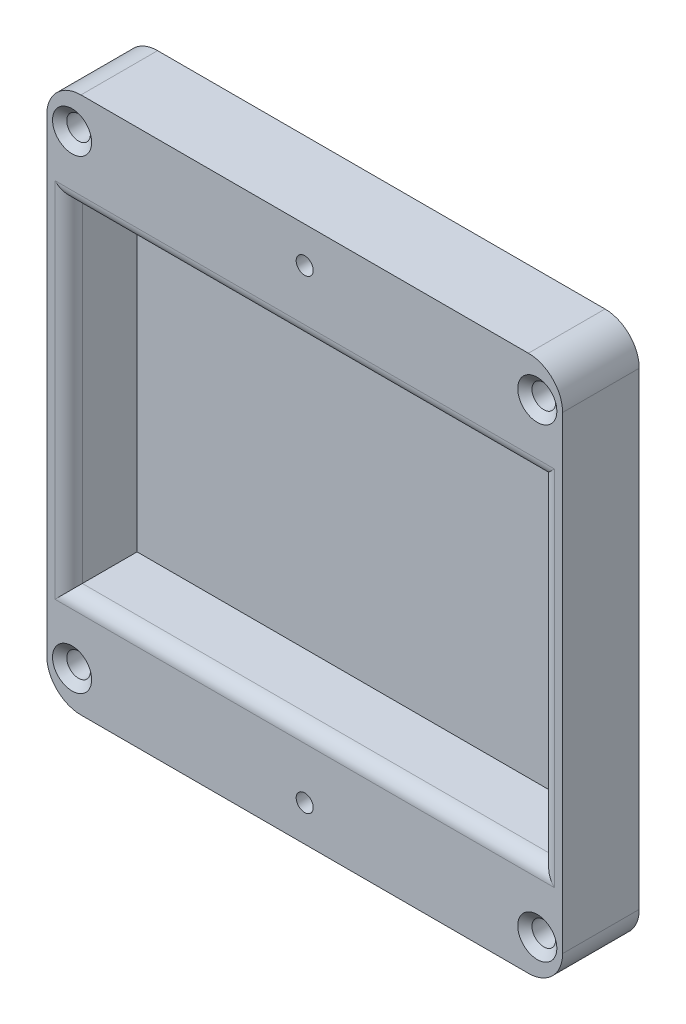
ISO-10303-21;
HEADER;
FILE_DESCRIPTION(('STEP AP214'),'2;1');
FILE_NAME('part.step','',(''),(''),'','','');
FILE_SCHEMA(('AUTOMOTIVE_DESIGN { 1 0 10303 214 1 1 1 1 }'));
ENDSEC;
DATA;
#1=APPLICATION_CONTEXT('core data for automotive mechanical design processes');
#2=APPLICATION_PROTOCOL_DEFINITION('international standard','automotive_design',2000,#1);
#3=PRODUCT_CONTEXT('',#1,'mechanical');
#4=PRODUCT('Part','Part','',(#3));
#5=PRODUCT_RELATED_PRODUCT_CATEGORY('part','',(#4));
#6=PRODUCT_DEFINITION_FORMATION('','',#4);
#7=PRODUCT_DEFINITION_CONTEXT('part definition',#1,'design');
#8=PRODUCT_DEFINITION('design','',#6,#7);
#9=PRODUCT_DEFINITION_SHAPE('','',#8);
#10=(LENGTH_UNIT() NAMED_UNIT(*) SI_UNIT(.MILLI.,.METRE.));
#11=(NAMED_UNIT(*) PLANE_ANGLE_UNIT() SI_UNIT($,.RADIAN.));
#12=(NAMED_UNIT(*) SI_UNIT($,.STERADIAN.) SOLID_ANGLE_UNIT());
#13=UNCERTAINTY_MEASURE_WITH_UNIT(LENGTH_MEASURE(1.E-05),#10,'distance_accuracy_value','');
#14=(GEOMETRIC_REPRESENTATION_CONTEXT(3) GLOBAL_UNCERTAINTY_ASSIGNED_CONTEXT((#13)) GLOBAL_UNIT_ASSIGNED_CONTEXT((#10,
#11,#12)) REPRESENTATION_CONTEXT('',''));
#15=CARTESIAN_POINT('',(0.,0.,0.));
#16=DIRECTION('',(0.,0.,1.));
#17=DIRECTION('',(1.,0.,0.));
#18=AXIS2_PLACEMENT_3D('',#15,#16,#17);
#19=CARTESIAN_POINT('',(37.7,-39.25,11.2));
#20=DIRECTION('',(-1.,0.,0.));
#21=DIRECTION('',(0.,0.,1.));
#22=AXIS2_PLACEMENT_3D('',#19,#20,#21);
#23=PLANE('',#22);
#24=DIRECTION('',(0.,1.,0.));
#25=VECTOR('',#24,1.);
#26=CARTESIAN_POINT('',(37.7,-39.25,11.2));
#27=LINE('',#26,#25);
#28=CARTESIAN_POINT('',(37.7,-34.25,11.2));
#29=VERTEX_POINT('',#28);
#30=CARTESIAN_POINT('',(37.7,34.25,11.2));
#31=VERTEX_POINT('',#30);
#32=EDGE_CURVE('E195',#29,#31,#27,.T.);
#33=ORIENTED_EDGE('',*,*,#32,.F.);
#34=DIRECTION('',(0.,0.,-1.));
#35=VECTOR('',#34,1.);
#36=CARTESIAN_POINT('',(37.7,-34.25,11.2));
#37=LINE('',#36,#35);
#38=CARTESIAN_POINT('',(37.7,-34.25,0.));
#39=VERTEX_POINT('',#38);
#40=EDGE_CURVE('E11',#29,#39,#37,.T.);
#41=ORIENTED_EDGE('',*,*,#40,.T.);
#42=DIRECTION('',(0.,1.,0.));
#43=VECTOR('',#42,1.);
#44=CARTESIAN_POINT('',(37.7,-39.25,0.));
#45=LINE('',#44,#43);
#46=CARTESIAN_POINT('',(37.7,34.25,0.));
#47=VERTEX_POINT('',#46);
#48=EDGE_CURVE('E188',#39,#47,#45,.T.);
#49=ORIENTED_EDGE('',*,*,#48,.T.);
#50=DIRECTION('',(0.,0.,-1.));
#51=VECTOR('',#50,1.);
#52=CARTESIAN_POINT('',(37.7,34.25,11.2));
#53=LINE('',#52,#51);
#54=EDGE_CURVE('E48',#47,#31,#53,.F.);
#55=ORIENTED_EDGE('',*,*,#54,.T.);
#56=EDGE_LOOP('',(#33,#41,#49,#55));
#57=FACE_BOUND('',#56,.T.);
#58=ADVANCED_FACE('F39',(#57),#23,.F.);
#59=CARTESIAN_POINT('',(-37.7,39.25,11.2));
#60=DIRECTION('',(0.,-1.,0.));
#61=DIRECTION('',(0.,0.,-1.));
#62=AXIS2_PLACEMENT_3D('',#59,#60,#61);
#63=PLANE('',#62);
#64=DIRECTION('',(-1.,0.,0.));
#65=VECTOR('',#64,1.);
#66=CARTESIAN_POINT('',(-37.7,39.25,0.));
#67=LINE('',#66,#65);
#68=CARTESIAN_POINT('',(32.7,39.25,0.));
#69=VERTEX_POINT('',#68);
#70=CARTESIAN_POINT('',(-32.7,39.25,0.));
#71=VERTEX_POINT('',#70);
#72=EDGE_CURVE('E214',#69,#71,#67,.T.);
#73=ORIENTED_EDGE('',*,*,#72,.T.);
#74=DIRECTION('',(0.,0.,-1.));
#75=VECTOR('',#74,1.);
#76=CARTESIAN_POINT('',(-32.7,39.25,11.2));
#77=LINE('',#76,#75);
#78=CARTESIAN_POINT('',(-32.7,39.25,11.2));
#79=VERTEX_POINT('',#78);
#80=EDGE_CURVE('E281',#71,#79,#77,.F.);
#81=ORIENTED_EDGE('',*,*,#80,.T.);
#82=DIRECTION('',(-1.,0.,0.));
#83=VECTOR('',#82,1.);
#84=CARTESIAN_POINT('',(-37.7,39.25,11.2));
#85=LINE('',#84,#83);
#86=CARTESIAN_POINT('',(32.7,39.25,11.2));
#87=VERTEX_POINT('',#86);
#88=EDGE_CURVE('E199',#87,#79,#85,.T.);
#89=ORIENTED_EDGE('',*,*,#88,.F.);
#90=DIRECTION('',(0.,0.,-1.));
#91=VECTOR('',#90,1.);
#92=CARTESIAN_POINT('',(32.7,39.25,11.2));
#93=LINE('',#92,#91);
#94=EDGE_CURVE('E277',#87,#69,#93,.T.);
#95=ORIENTED_EDGE('',*,*,#94,.T.);
#96=EDGE_LOOP('',(#73,#81,#89,#95));
#97=FACE_BOUND('',#96,.T.);
#98=ADVANCED_FACE('F314',(#97),#63,.F.);
#99=CARTESIAN_POINT('',(-37.7,-39.25,11.2));
#100=DIRECTION('',(1.,0.,0.));
#101=DIRECTION('',(0.,0.,-1.));
#102=AXIS2_PLACEMENT_3D('',#99,#100,#101);
#103=PLANE('',#102);
#104=DIRECTION('',(0.,-1.,0.));
#105=VECTOR('',#104,1.);
#106=CARTESIAN_POINT('',(-37.7,-39.25,11.2));
#107=LINE('',#106,#105);
#108=CARTESIAN_POINT('',(-37.7,34.25,11.2));
#109=VERTEX_POINT('',#108);
#110=CARTESIAN_POINT('',(-37.7,-34.25,11.2));
#111=VERTEX_POINT('',#110);
#112=EDGE_CURVE('E204',#109,#111,#107,.T.);
#113=ORIENTED_EDGE('',*,*,#112,.F.);
#114=DIRECTION('',(0.,0.,-1.));
#115=VECTOR('',#114,1.);
#116=CARTESIAN_POINT('',(-37.7,34.25,11.2));
#117=LINE('',#116,#115);
#118=CARTESIAN_POINT('',(-37.7,34.25,0.));
#119=VERTEX_POINT('',#118);
#120=EDGE_CURVE('E261',#109,#119,#117,.T.);
#121=ORIENTED_EDGE('',*,*,#120,.T.);
#122=DIRECTION('',(0.,-1.,0.));
#123=VECTOR('',#122,1.);
#124=CARTESIAN_POINT('',(-37.7,-39.25,0.));
#125=LINE('',#124,#123);
#126=CARTESIAN_POINT('',(-37.7,-34.25,0.));
#127=VERTEX_POINT('',#126);
#128=EDGE_CURVE('E218',#119,#127,#125,.T.);
#129=ORIENTED_EDGE('',*,*,#128,.T.);
#130=DIRECTION('',(0.,0.,-1.));
#131=VECTOR('',#130,1.);
#132=CARTESIAN_POINT('',(-37.7,-34.25,11.2));
#133=LINE('',#132,#131);
#134=EDGE_CURVE('E248',#127,#111,#133,.F.);
#135=ORIENTED_EDGE('',*,*,#134,.T.);
#136=EDGE_LOOP('',(#113,#121,#129,#135));
#137=FACE_BOUND('',#136,.T.);
#138=ADVANCED_FACE('F325',(#137),#103,.F.);
#139=CARTESIAN_POINT('',(-37.7,-39.25,11.2));
#140=DIRECTION('',(0.,1.,0.));
#141=DIRECTION('',(0.,0.,1.));
#142=AXIS2_PLACEMENT_3D('',#139,#140,#141);
#143=PLANE('',#142);
#144=DIRECTION('',(1.,0.,0.));
#145=VECTOR('',#144,1.);
#146=CARTESIAN_POINT('',(-37.7,-39.25,11.2));
#147=LINE('',#146,#145);
#148=CARTESIAN_POINT('',(-32.7,-39.25,11.2));
#149=VERTEX_POINT('',#148);
#150=CARTESIAN_POINT('',(32.7,-39.25,11.2));
#151=VERTEX_POINT('',#150);
#152=EDGE_CURVE('E207',#149,#151,#147,.T.);
#153=ORIENTED_EDGE('',*,*,#152,.F.);
#154=DIRECTION('',(0.,0.,-1.));
#155=VECTOR('',#154,1.);
#156=CARTESIAN_POINT('',(-32.7,-39.25,11.2));
#157=LINE('',#156,#155);
#158=CARTESIAN_POINT('',(-32.7,-39.25,0.));
#159=VERTEX_POINT('',#158);
#160=EDGE_CURVE('E297',#149,#159,#157,.T.);
#161=ORIENTED_EDGE('',*,*,#160,.T.);
#162=DIRECTION('',(1.,0.,0.));
#163=VECTOR('',#162,1.);
#164=CARTESIAN_POINT('',(-37.7,-39.25,0.));
#165=LINE('',#164,#163);
#166=CARTESIAN_POINT('',(32.7,-39.25,0.));
#167=VERTEX_POINT('',#166);
#168=EDGE_CURVE('E200',#159,#167,#165,.T.);
#169=ORIENTED_EDGE('',*,*,#168,.T.);
#170=DIRECTION('',(0.,0.,-1.));
#171=VECTOR('',#170,1.);
#172=CARTESIAN_POINT('',(32.7,-39.25,11.2));
#173=LINE('',#172,#171);
#174=EDGE_CURVE('E55',#167,#151,#173,.F.);
#175=ORIENTED_EDGE('',*,*,#174,.T.);
#176=EDGE_LOOP('',(#153,#161,#169,#175));
#177=FACE_BOUND('',#176,.T.);
#178=ADVANCED_FACE('F331',(#177),#143,.F.);
#179=CARTESIAN_POINT('',(0.,0.,11.2));
#180=DIRECTION('',(0.,0.,-1.));
#181=DIRECTION('',(-1.,0.,0.));
#182=AXIS2_PLACEMENT_3D('',#179,#180,#181);
#183=PLANE('',#182);
#184=CARTESIAN_POINT('',(34.,-34.,11.2));
#185=DIRECTION('',(0.,0.,1.));
#186=DIRECTION('',(1.,0.,0.));
#187=AXIS2_PLACEMENT_3D('',#184,#185,#186);
#188=CIRCLE('',#187,2.8575);
#189=CARTESIAN_POINT('',(36.8575,-34.,11.2));
#190=VERTEX_POINT('',#189);
#191=EDGE_CURVE('E624',#190,#190,#188,.T.);
#192=ORIENTED_EDGE('',*,*,#191,.F.);
#193=EDGE_LOOP('',(#192));
#194=FACE_BOUND('',#193,.T.);
#195=CARTESIAN_POINT('',(-34.,-34.,11.2));
#196=DIRECTION('',(0.,0.,1.));
#197=DIRECTION('',(1.,0.,0.));
#198=AXIS2_PLACEMENT_3D('',#195,#196,#197);
#199=CIRCLE('',#198,2.8575);
#200=CARTESIAN_POINT('',(-31.1425,-34.,11.2));
#201=VERTEX_POINT('',#200);
#202=EDGE_CURVE('E634',#201,#201,#199,.T.);
#203=ORIENTED_EDGE('',*,*,#202,.F.);
#204=EDGE_LOOP('',(#203));
#205=FACE_BOUND('',#204,.T.);
#206=CARTESIAN_POINT('',(-34.,34.,11.2));
#207=DIRECTION('',(0.,0.,1.));
#208=DIRECTION('',(1.,0.,0.));
#209=AXIS2_PLACEMENT_3D('',#206,#207,#208);
#210=CIRCLE('',#209,2.8575);
#211=CARTESIAN_POINT('',(-31.1425,34.,11.2));
#212=VERTEX_POINT('',#211);
#213=EDGE_CURVE('E646',#212,#212,#210,.T.);
#214=ORIENTED_EDGE('',*,*,#213,.F.);
#215=EDGE_LOOP('',(#214));
#216=FACE_BOUND('',#215,.T.);
#217=CARTESIAN_POINT('',(34.,34.,11.2));
#218=DIRECTION('',(0.,0.,1.));
#219=DIRECTION('',(1.,0.,0.));
#220=AXIS2_PLACEMENT_3D('',#217,#218,#219);
#221=CIRCLE('',#220,2.8575);
#222=CARTESIAN_POINT('',(36.8575,34.,11.2));
#223=VERTEX_POINT('',#222);
#224=EDGE_CURVE('E658',#223,#223,#221,.T.);
#225=ORIENTED_EDGE('',*,*,#224,.F.);
#226=EDGE_LOOP('',(#225));
#227=FACE_BOUND('',#226,.T.);
#228=CARTESIAN_POINT('',(0.,34.,11.2));
#229=DIRECTION('',(0.,0.,1.));
#230=DIRECTION('',(1.,0.,0.));
#231=AXIS2_PLACEMENT_3D('',#228,#229,#230);
#232=CIRCLE('',#231,1.2446);
#233=CARTESIAN_POINT('',(1.2446,34.,11.2));
#234=VERTEX_POINT('',#233);
#235=EDGE_CURVE('E672',#234,#234,#232,.T.);
#236=ORIENTED_EDGE('',*,*,#235,.F.);
#237=EDGE_LOOP('',(#236));
#238=FACE_BOUND('',#237,.T.);
#239=CARTESIAN_POINT('',(0.,-34.,11.2));
#240=DIRECTION('',(0.,0.,1.));
#241=DIRECTION('',(-1.,0.,0.));
#242=AXIS2_PLACEMENT_3D('',#239,#240,#241);
#243=CIRCLE('',#242,1.2446);
#244=CARTESIAN_POINT('',(-1.2446,-34.,11.2));
#245=VERTEX_POINT('',#244);
#246=EDGE_CURVE('E178',#245,#245,#243,.T.);
#247=ORIENTED_EDGE('',*,*,#246,.F.);
#248=EDGE_LOOP('',(#247));
#249=FACE_BOUND('',#248,.T.);
#250=DIRECTION('',(1.,0.,0.));
#251=VECTOR('',#250,1.);
#252=CARTESIAN_POINT('',(0.,-26.5,11.2));
#253=LINE('',#252,#251);
#254=CARTESIAN_POINT('',(36.5,-26.5,11.2));
#255=VERTEX_POINT('',#254);
#256=CARTESIAN_POINT('',(-36.5,-26.5,11.2));
#257=VERTEX_POINT('',#256);
#258=EDGE_CURVE('E233',#255,#257,#253,.F.);
#259=ORIENTED_EDGE('',*,*,#258,.T.);
#260=DIRECTION('',(0.,-1.,0.));
#261=VECTOR('',#260,1.);
#262=CARTESIAN_POINT('',(-36.5,0.,11.2));
#263=LINE('',#262,#261);
#264=CARTESIAN_POINT('',(-36.5,26.5,11.2));
#265=VERTEX_POINT('',#264);
#266=EDGE_CURVE('E236',#257,#265,#263,.F.);
#267=ORIENTED_EDGE('',*,*,#266,.T.);
#268=DIRECTION('',(-1.,0.,0.));
#269=VECTOR('',#268,1.);
#270=CARTESIAN_POINT('',(0.,26.5,11.2));
#271=LINE('',#270,#269);
#272=CARTESIAN_POINT('',(36.5,26.5,11.2));
#273=VERTEX_POINT('',#272);
#274=EDGE_CURVE('E227',#265,#273,#271,.F.);
#275=ORIENTED_EDGE('',*,*,#274,.T.);
#276=DIRECTION('',(0.,1.,0.));
#277=VECTOR('',#276,1.);
#278=CARTESIAN_POINT('',(36.5,0.,11.2));
#279=LINE('',#278,#277);
#280=EDGE_CURVE('E230',#273,#255,#279,.F.);
#281=ORIENTED_EDGE('',*,*,#280,.T.);
#282=EDGE_LOOP('',(#259,#267,#275,#281));
#283=FACE_BOUND('',#282,.T.);
#284=ORIENTED_EDGE('',*,*,#88,.T.);
#285=CARTESIAN_POINT('',(-32.7,34.25,11.2));
#286=DIRECTION('',(0.,0.,-1.));
#287=DIRECTION('',(-1.,0.,0.));
#288=AXIS2_PLACEMENT_3D('',#285,#286,#287);
#289=CIRCLE('',#288,5.);
#290=EDGE_CURVE('E292',#79,#109,#289,.F.);
#291=ORIENTED_EDGE('',*,*,#290,.T.);
#292=ORIENTED_EDGE('',*,*,#112,.T.);
#293=CARTESIAN_POINT('',(-32.7,-34.25,11.2));
#294=DIRECTION('',(0.,0.,-1.));
#295=DIRECTION('',(-1.,0.,0.));
#296=AXIS2_PLACEMENT_3D('',#293,#294,#295);
#297=CIRCLE('',#296,5.);
#298=EDGE_CURVE('E62',#111,#149,#297,.F.);
#299=ORIENTED_EDGE('',*,*,#298,.T.);
#300=ORIENTED_EDGE('',*,*,#152,.T.);
#301=CARTESIAN_POINT('',(32.7,-34.25,11.2));
#302=DIRECTION('',(0.,0.,-1.));
#303=DIRECTION('',(-1.,0.,0.));
#304=AXIS2_PLACEMENT_3D('',#301,#302,#303);
#305=CIRCLE('',#304,5.);
#306=EDGE_CURVE('E287',#151,#29,#305,.F.);
#307=ORIENTED_EDGE('',*,*,#306,.T.);
#308=ORIENTED_EDGE('',*,*,#32,.T.);
#309=CARTESIAN_POINT('',(32.7,34.25,11.2));
#310=DIRECTION('',(0.,0.,-1.));
#311=DIRECTION('',(-1.,0.,0.));
#312=AXIS2_PLACEMENT_3D('',#309,#310,#311);
#313=CIRCLE('',#312,5.);
#314=EDGE_CURVE('E284',#31,#87,#313,.F.);
#315=ORIENTED_EDGE('',*,*,#314,.T.);
#316=EDGE_LOOP('',(#284,#291,#292,#299,#300,#307,#308,#315));
#317=FACE_BOUND('',#316,.T.);
#318=ADVANCED_FACE('F308',(#194,#205,#216,#227,#238,#249,#283,#317),#183,.F.);
#319=CARTESIAN_POINT('',(0.,0.,0.));
#320=DIRECTION('',(0.,0.,-1.));
#321=DIRECTION('',(-1.,0.,0.));
#322=AXIS2_PLACEMENT_3D('',#319,#320,#321);
#323=PLANE('',#322);
#324=CARTESIAN_POINT('',(34.,-34.,0.));
#325=DIRECTION('',(0.,0.,1.));
#326=DIRECTION('',(1.,0.,0.));
#327=AXIS2_PLACEMENT_3D('',#324,#325,#326);
#328=CIRCLE('',#327,1.7272);
#329=CARTESIAN_POINT('',(35.7272,-34.,0.));
#330=VERTEX_POINT('',#329);
#331=EDGE_CURVE('E628',#330,#330,#328,.T.);
#332=ORIENTED_EDGE('',*,*,#331,.T.);
#333=EDGE_LOOP('',(#332));
#334=FACE_BOUND('',#333,.T.);
#335=CARTESIAN_POINT('',(-34.,-34.,0.));
#336=DIRECTION('',(0.,0.,1.));
#337=DIRECTION('',(1.,0.,0.));
#338=AXIS2_PLACEMENT_3D('',#335,#336,#337);
#339=CIRCLE('',#338,1.7272);
#340=CARTESIAN_POINT('',(-32.2728,-34.,0.));
#341=VERTEX_POINT('',#340);
#342=EDGE_CURVE('E642',#341,#341,#339,.T.);
#343=ORIENTED_EDGE('',*,*,#342,.T.);
#344=EDGE_LOOP('',(#343));
#345=FACE_BOUND('',#344,.T.);
#346=CARTESIAN_POINT('',(-34.,34.,0.));
#347=DIRECTION('',(0.,0.,1.));
#348=DIRECTION('',(1.,0.,0.));
#349=AXIS2_PLACEMENT_3D('',#346,#347,#348);
#350=CIRCLE('',#349,1.7272);
#351=CARTESIAN_POINT('',(-32.2728,34.,0.));
#352=VERTEX_POINT('',#351);
#353=EDGE_CURVE('E654',#352,#352,#350,.T.);
#354=ORIENTED_EDGE('',*,*,#353,.T.);
#355=EDGE_LOOP('',(#354));
#356=FACE_BOUND('',#355,.T.);
#357=CARTESIAN_POINT('',(34.,34.,0.));
#358=DIRECTION('',(0.,0.,1.));
#359=DIRECTION('',(1.,0.,0.));
#360=AXIS2_PLACEMENT_3D('',#357,#358,#359);
#361=CIRCLE('',#360,1.7272);
#362=CARTESIAN_POINT('',(35.7272,34.,0.));
#363=VERTEX_POINT('',#362);
#364=EDGE_CURVE('E666',#363,#363,#361,.T.);
#365=ORIENTED_EDGE('',*,*,#364,.T.);
#366=EDGE_LOOP('',(#365));
#367=FACE_BOUND('',#366,.T.);
#368=ORIENTED_EDGE('',*,*,#128,.F.);
#369=CARTESIAN_POINT('',(-32.7,34.25,0.));
#370=DIRECTION('',(0.,0.,-1.));
#371=DIRECTION('',(-1.,0.,0.));
#372=AXIS2_PLACEMENT_3D('',#369,#370,#371);
#373=CIRCLE('',#372,5.);
#374=EDGE_CURVE('E274',#119,#71,#373,.T.);
#375=ORIENTED_EDGE('',*,*,#374,.T.);
#376=ORIENTED_EDGE('',*,*,#72,.F.);
#377=CARTESIAN_POINT('',(32.7,34.25,0.));
#378=DIRECTION('',(0.,0.,-1.));
#379=DIRECTION('',(-1.,0.,0.));
#380=AXIS2_PLACEMENT_3D('',#377,#378,#379);
#381=CIRCLE('',#380,5.);
#382=EDGE_CURVE('E265',#69,#47,#381,.T.);
#383=ORIENTED_EDGE('',*,*,#382,.T.);
#384=ORIENTED_EDGE('',*,*,#48,.F.);
#385=CARTESIAN_POINT('',(32.7,-34.25,0.));
#386=DIRECTION('',(0.,0.,-1.));
#387=DIRECTION('',(-1.,0.,0.));
#388=AXIS2_PLACEMENT_3D('',#385,#386,#387);
#389=CIRCLE('',#388,5.);
#390=EDGE_CURVE('E268',#39,#167,#389,.T.);
#391=ORIENTED_EDGE('',*,*,#390,.T.);
#392=ORIENTED_EDGE('',*,*,#168,.F.);
#393=CARTESIAN_POINT('',(-32.7,-34.25,0.));
#394=DIRECTION('',(0.,0.,-1.));
#395=DIRECTION('',(-1.,0.,0.));
#396=AXIS2_PLACEMENT_3D('',#393,#394,#395);
#397=CIRCLE('',#396,5.);
#398=EDGE_CURVE('E271',#159,#127,#397,.T.);
#399=ORIENTED_EDGE('',*,*,#398,.T.);
#400=EDGE_LOOP('',(#368,#375,#376,#383,#384,#391,#392,#399));
#401=FACE_BOUND('',#400,.T.);
#402=ADVANCED_FACE('F318',(#334,#345,#356,#367,#401),#323,.T.);
#403=CARTESIAN_POINT('',(34.5,24.5,1.2));
#404=DIRECTION('',(1.,0.,0.));
#405=DIRECTION('',(0.,0.,-1.));
#406=AXIS2_PLACEMENT_3D('',#403,#404,#405);
#407=PLANE('',#406);
#408=DIRECTION('',(0.,0.,1.));
#409=VECTOR('',#408,1.);
#410=CARTESIAN_POINT('',(34.5,-24.5,1.2));
#411=LINE('',#410,#409);
#412=CARTESIAN_POINT('',(34.5,-24.5,1.2));
#413=VERTEX_POINT('',#412);
#414=CARTESIAN_POINT('',(34.5,-24.5,9.2));
#415=VERTEX_POINT('',#414);
#416=EDGE_CURVE('E185',#413,#415,#411,.T.);
#417=ORIENTED_EDGE('',*,*,#416,.T.);
#418=DIRECTION('',(0.,1.,0.));
#419=VECTOR('',#418,1.);
#420=CARTESIAN_POINT('',(34.5,24.5,9.2));
#421=LINE('',#420,#419);
#422=CARTESIAN_POINT('',(34.5,24.5,9.2));
#423=VERTEX_POINT('',#422);
#424=EDGE_CURVE('E151',#415,#423,#421,.T.);
#425=ORIENTED_EDGE('',*,*,#424,.T.);
#426=DIRECTION('',(0.,0.,1.));
#427=VECTOR('',#426,1.);
#428=CARTESIAN_POINT('',(34.5,24.5,1.2));
#429=LINE('',#428,#427);
#430=CARTESIAN_POINT('',(34.5,24.5,1.2));
#431=VERTEX_POINT('',#430);
#432=EDGE_CURVE('E143',#431,#423,#429,.T.);
#433=ORIENTED_EDGE('',*,*,#432,.F.);
#434=DIRECTION('',(0.,1.,0.));
#435=VECTOR('',#434,1.);
#436=CARTESIAN_POINT('',(34.5,24.5,1.2));
#437=LINE('',#436,#435);
#438=EDGE_CURVE('E148',#413,#431,#437,.T.);
#439=ORIENTED_EDGE('',*,*,#438,.F.);
#440=EDGE_LOOP('',(#417,#425,#433,#439));
#441=FACE_BOUND('',#440,.T.);
#442=ADVANCED_FACE('F146',(#441),#407,.F.);
#443=CARTESIAN_POINT('',(-34.5,-24.5,1.2));
#444=DIRECTION('',(0.,-1.,0.));
#445=DIRECTION('',(0.,0.,-1.));
#446=AXIS2_PLACEMENT_3D('',#443,#444,#445);
#447=PLANE('',#446);
#448=DIRECTION('',(0.,0.,1.));
#449=VECTOR('',#448,1.);
#450=CARTESIAN_POINT('',(-34.5,-24.5,1.2));
#451=LINE('',#450,#449);
#452=CARTESIAN_POINT('',(-34.5,-24.5,1.2));
#453=VERTEX_POINT('',#452);
#454=CARTESIAN_POINT('',(-34.5,-24.5,9.2));
#455=VERTEX_POINT('',#454);
#456=EDGE_CURVE('E189',#453,#455,#451,.T.);
#457=ORIENTED_EDGE('',*,*,#456,.T.);
#458=DIRECTION('',(1.,0.,0.));
#459=VECTOR('',#458,1.);
#460=CARTESIAN_POINT('',(-34.5,-24.5,9.2));
#461=LINE('',#460,#459);
#462=EDGE_CURVE('E240',#455,#415,#461,.T.);
#463=ORIENTED_EDGE('',*,*,#462,.T.);
#464=ORIENTED_EDGE('',*,*,#416,.F.);
#465=DIRECTION('',(1.,0.,0.));
#466=VECTOR('',#465,1.);
#467=CARTESIAN_POINT('',(-34.5,-24.5,1.2));
#468=LINE('',#467,#466);
#469=EDGE_CURVE('E156',#453,#413,#468,.T.);
#470=ORIENTED_EDGE('',*,*,#469,.F.);
#471=EDGE_LOOP('',(#457,#463,#464,#470));
#472=FACE_BOUND('',#471,.T.);
#473=ADVANCED_FACE('F392',(#472),#447,.F.);
#474=CARTESIAN_POINT('',(-34.5,24.5,1.2));
#475=DIRECTION('',(-1.,0.,0.));
#476=DIRECTION('',(0.,-1.,0.));
#477=AXIS2_PLACEMENT_3D('',#474,#475,#476);
#478=PLANE('',#477);
#479=DIRECTION('',(0.,0.,1.));
#480=VECTOR('',#479,1.);
#481=CARTESIAN_POINT('',(-34.5,24.5,1.2));
#482=LINE('',#481,#480);
#483=CARTESIAN_POINT('',(-34.5,24.5,1.2));
#484=VERTEX_POINT('',#483);
#485=CARTESIAN_POINT('',(-34.5,24.5,9.2));
#486=VERTEX_POINT('',#485);
#487=EDGE_CURVE('E155',#484,#486,#482,.T.);
#488=ORIENTED_EDGE('',*,*,#487,.T.);
#489=DIRECTION('',(0.,-1.,0.));
#490=VECTOR('',#489,1.);
#491=CARTESIAN_POINT('',(-34.5,24.5,9.2));
#492=LINE('',#491,#490);
#493=EDGE_CURVE('E210',#486,#455,#492,.T.);
#494=ORIENTED_EDGE('',*,*,#493,.T.);
#495=ORIENTED_EDGE('',*,*,#456,.F.);
#496=DIRECTION('',(0.,-1.,0.));
#497=VECTOR('',#496,1.);
#498=CARTESIAN_POINT('',(-34.5,24.5,1.2));
#499=LINE('',#498,#497);
#500=EDGE_CURVE('E166',#484,#453,#499,.T.);
#501=ORIENTED_EDGE('',*,*,#500,.F.);
#502=EDGE_LOOP('',(#488,#494,#495,#501));
#503=FACE_BOUND('',#502,.T.);
#504=ADVANCED_FACE('F395',(#503),#478,.F.);
#505=CARTESIAN_POINT('',(-34.5,24.5,1.2));
#506=DIRECTION('',(0.,1.,0.));
#507=DIRECTION('',(0.,0.,1.));
#508=AXIS2_PLACEMENT_3D('',#505,#506,#507);
#509=PLANE('',#508);
#510=ORIENTED_EDGE('',*,*,#432,.T.);
#511=DIRECTION('',(-1.,0.,0.));
#512=VECTOR('',#511,1.);
#513=CARTESIAN_POINT('',(-34.5,24.5,9.2));
#514=LINE('',#513,#512);
#515=EDGE_CURVE('E245',#423,#486,#514,.T.);
#516=ORIENTED_EDGE('',*,*,#515,.T.);
#517=ORIENTED_EDGE('',*,*,#487,.F.);
#518=DIRECTION('',(-1.,0.,0.));
#519=VECTOR('',#518,1.);
#520=CARTESIAN_POINT('',(-34.5,24.5,1.2));
#521=LINE('',#520,#519);
#522=EDGE_CURVE('E159',#431,#484,#521,.T.);
#523=ORIENTED_EDGE('',*,*,#522,.F.);
#524=EDGE_LOOP('',(#510,#516,#517,#523));
#525=FACE_BOUND('',#524,.T.);
#526=ADVANCED_FACE('F160',(#525),#509,.F.);
#527=CARTESIAN_POINT('',(0.,0.,1.2));
#528=DIRECTION('',(0.,0.,1.));
#529=DIRECTION('',(1.,0.,0.));
#530=AXIS2_PLACEMENT_3D('',#527,#528,#529);
#531=PLANE('',#530);
#532=ORIENTED_EDGE('',*,*,#438,.T.);
#533=ORIENTED_EDGE('',*,*,#522,.T.);
#534=ORIENTED_EDGE('',*,*,#500,.T.);
#535=ORIENTED_EDGE('',*,*,#469,.T.);
#536=EDGE_LOOP('',(#532,#533,#534,#535));
#537=FACE_BOUND('',#536,.T.);
#538=ADVANCED_FACE('F168',(#537),#531,.T.);
#539=CARTESIAN_POINT('',(36.5,24.5,9.2));
#540=DIRECTION('',(0.,1.,0.));
#541=DIRECTION('',(0.,0.,1.));
#542=AXIS2_PLACEMENT_3D('',#539,#540,#541);
#543=CYLINDRICAL_SURFACE('',#542,2.);
#544=CARTESIAN_POINT('',(36.5,-26.5,9.2));
#545=DIRECTION('',(0.707106781186547,0.707106781186547,0.));
#546=DIRECTION('',(0.707106781186547,-0.707106781186547,0.));
#547=AXIS2_PLACEMENT_3D('',#544,#545,#546);
#548=ELLIPSE('',#547,2.82842712474619,2.);
#549=EDGE_CURVE('E175',#255,#415,#548,.F.);
#550=ORIENTED_EDGE('',*,*,#549,.F.);
#551=ORIENTED_EDGE('',*,*,#280,.F.);
#552=CARTESIAN_POINT('',(36.5,26.5,9.2));
#553=DIRECTION('',(-0.707106781186547,0.707106781186547,0.));
#554=DIRECTION('',(0.707106781186547,0.707106781186547,0.));
#555=AXIS2_PLACEMENT_3D('',#552,#553,#554);
#556=ELLIPSE('',#555,2.82842712474619,2.);
#557=EDGE_CURVE('E171',#423,#273,#556,.T.);
#558=ORIENTED_EDGE('',*,*,#557,.F.);
#559=ORIENTED_EDGE('',*,*,#424,.F.);
#560=EDGE_LOOP('',(#550,#551,#558,#559));
#561=FACE_BOUND('',#560,.T.);
#562=ADVANCED_FACE('F361',(#561),#543,.T.);
#563=CARTESIAN_POINT('',(-34.5,26.5,9.2));
#564=DIRECTION('',(-1.,0.,0.));
#565=DIRECTION('',(0.,0.,1.));
#566=AXIS2_PLACEMENT_3D('',#563,#564,#565);
#567=CYLINDRICAL_SURFACE('',#566,2.);
#568=ORIENTED_EDGE('',*,*,#557,.T.);
#569=ORIENTED_EDGE('',*,*,#274,.F.);
#570=CARTESIAN_POINT('',(-36.5,26.5,9.2));
#571=DIRECTION('',(-0.707106781186547,-0.707106781186548,0.));
#572=DIRECTION('',(0.707106781186548,-0.707106781186547,0.));
#573=AXIS2_PLACEMENT_3D('',#570,#571,#572);
#574=ELLIPSE('',#573,2.82842712474619,2.);
#575=EDGE_CURVE('E252',#486,#265,#574,.T.);
#576=ORIENTED_EDGE('',*,*,#575,.F.);
#577=ORIENTED_EDGE('',*,*,#515,.F.);
#578=EDGE_LOOP('',(#568,#569,#576,#577));
#579=FACE_BOUND('',#578,.T.);
#580=ADVANCED_FACE('F357',(#579),#567,.T.);
#581=CARTESIAN_POINT('',(-34.5,-26.5,9.2));
#582=DIRECTION('',(1.,0.,0.));
#583=DIRECTION('',(0.,0.,-1.));
#584=AXIS2_PLACEMENT_3D('',#581,#582,#583);
#585=CYLINDRICAL_SURFACE('',#584,2.);
#586=ORIENTED_EDGE('',*,*,#549,.T.);
#587=ORIENTED_EDGE('',*,*,#462,.F.);
#588=CARTESIAN_POINT('',(-36.5,-26.5,9.2));
#589=DIRECTION('',(0.707106781186548,-0.707106781186547,0.));
#590=DIRECTION('',(-0.707106781186547,-0.707106781186548,0.));
#591=AXIS2_PLACEMENT_3D('',#588,#589,#590);
#592=ELLIPSE('',#591,2.82842712474619,2.);
#593=EDGE_CURVE('E249',#257,#455,#592,.F.);
#594=ORIENTED_EDGE('',*,*,#593,.F.);
#595=ORIENTED_EDGE('',*,*,#258,.F.);
#596=EDGE_LOOP('',(#586,#587,#594,#595));
#597=FACE_BOUND('',#596,.T.);
#598=ADVANCED_FACE('F353',(#597),#585,.T.);
#599=CARTESIAN_POINT('',(-36.5,24.5,9.2));
#600=DIRECTION('',(0.,-1.,0.));
#601=DIRECTION('',(1.,0.,0.));
#602=AXIS2_PLACEMENT_3D('',#599,#600,#601);
#603=CYLINDRICAL_SURFACE('',#602,2.);
#604=ORIENTED_EDGE('',*,*,#575,.T.);
#605=ORIENTED_EDGE('',*,*,#266,.F.);
#606=ORIENTED_EDGE('',*,*,#593,.T.);
#607=ORIENTED_EDGE('',*,*,#493,.F.);
#608=EDGE_LOOP('',(#604,#605,#606,#607));
#609=FACE_BOUND('',#608,.T.);
#610=ADVANCED_FACE('F349',(#609),#603,.T.);
#611=CARTESIAN_POINT('',(0.,-34.,1.2));
#612=DIRECTION('',(0.,0.,1.));
#613=DIRECTION('',(1.,0.,0.));
#614=AXIS2_PLACEMENT_3D('',#611,#612,#613);
#615=CYLINDRICAL_SURFACE('',#614,1.2446);
#616=CARTESIAN_POINT('',(0.,-34.,1.2));
#617=DIRECTION('',(0.,0.,1.));
#618=DIRECTION('',(-1.,0.,0.));
#619=AXIS2_PLACEMENT_3D('',#616,#617,#618);
#620=CIRCLE('',#619,1.2446);
#621=CARTESIAN_POINT('',(-1.2446,-34.,1.2));
#622=VERTEX_POINT('',#621);
#623=EDGE_CURVE('E675',#622,#622,#620,.T.);
#624=ORIENTED_EDGE('',*,*,#623,.F.);
#625=EDGE_LOOP('',(#624));
#626=FACE_BOUND('',#625,.T.);
#627=ORIENTED_EDGE('',*,*,#246,.T.);
#628=EDGE_LOOP('',(#627));
#629=FACE_BOUND('',#628,.T.);
#630=ADVANCED_FACE('F352',(#626,#629),#615,.F.);
#631=CARTESIAN_POINT('',(0.,-34.,1.2));
#632=DIRECTION('',(0.,0.,-1.));
#633=DIRECTION('',(-1.,0.,0.));
#634=AXIS2_PLACEMENT_3D('',#631,#632,#633);
#635=PLANE('',#634);
#636=ORIENTED_EDGE('',*,*,#623,.T.);
#637=EDGE_LOOP('',(#636));
#638=FACE_BOUND('',#637,.T.);
#639=ADVANCED_FACE('F377',(#638),#635,.F.);
#640=CARTESIAN_POINT('',(0.,34.,1.2));
#641=DIRECTION('',(0.,0.,1.));
#642=DIRECTION('',(1.,0.,0.));
#643=AXIS2_PLACEMENT_3D('',#640,#641,#642);
#644=CYLINDRICAL_SURFACE('',#643,1.2446);
#645=CARTESIAN_POINT('',(0.,34.,1.2));
#646=DIRECTION('',(0.,0.,1.));
#647=DIRECTION('',(1.,0.,0.));
#648=AXIS2_PLACEMENT_3D('',#645,#646,#647);
#649=CIRCLE('',#648,1.2446);
#650=CARTESIAN_POINT('',(1.2446,34.,1.2));
#651=VERTEX_POINT('',#650);
#652=EDGE_CURVE('E253',#651,#651,#649,.T.);
#653=ORIENTED_EDGE('',*,*,#652,.F.);
#654=EDGE_LOOP('',(#653));
#655=FACE_BOUND('',#654,.T.);
#656=ORIENTED_EDGE('',*,*,#235,.T.);
#657=EDGE_LOOP('',(#656));
#658=FACE_BOUND('',#657,.T.);
#659=ADVANCED_FACE('F371',(#655,#658),#644,.F.);
#660=CARTESIAN_POINT('',(0.,34.,1.2));
#661=DIRECTION('',(0.,0.,1.));
#662=DIRECTION('',(1.,0.,0.));
#663=AXIS2_PLACEMENT_3D('',#660,#661,#662);
#664=PLANE('',#663);
#665=ORIENTED_EDGE('',*,*,#652,.T.);
#666=EDGE_LOOP('',(#665));
#667=FACE_BOUND('',#666,.T.);
#668=ADVANCED_FACE('F367',(#667),#664,.T.);
#669=CARTESIAN_POINT('',(-32.7,34.25,11.2));
#670=DIRECTION('',(0.,0.,-1.));
#671=DIRECTION('',(-1.,0.,0.));
#672=AXIS2_PLACEMENT_3D('',#669,#670,#671);
#673=CYLINDRICAL_SURFACE('',#672,5.);
#674=ORIENTED_EDGE('',*,*,#290,.F.);
#675=ORIENTED_EDGE('',*,*,#80,.F.);
#676=ORIENTED_EDGE('',*,*,#374,.F.);
#677=ORIENTED_EDGE('',*,*,#120,.F.);
#678=EDGE_LOOP('',(#674,#675,#676,#677));
#679=FACE_BOUND('',#678,.T.);
#680=ADVANCED_FACE('F322',(#679),#673,.T.);
#681=CARTESIAN_POINT('',(-32.7,-34.25,11.2));
#682=DIRECTION('',(0.,0.,-1.));
#683=DIRECTION('',(-1.,0.,0.));
#684=AXIS2_PLACEMENT_3D('',#681,#682,#683);
#685=CYLINDRICAL_SURFACE('',#684,5.);
#686=ORIENTED_EDGE('',*,*,#298,.F.);
#687=ORIENTED_EDGE('',*,*,#134,.F.);
#688=ORIENTED_EDGE('',*,*,#398,.F.);
#689=ORIENTED_EDGE('',*,*,#160,.F.);
#690=EDGE_LOOP('',(#686,#687,#688,#689));
#691=FACE_BOUND('',#690,.T.);
#692=ADVANCED_FACE('F329',(#691),#685,.T.);
#693=CARTESIAN_POINT('',(32.7,-34.25,11.2));
#694=DIRECTION('',(0.,0.,-1.));
#695=DIRECTION('',(-1.,0.,0.));
#696=AXIS2_PLACEMENT_3D('',#693,#694,#695);
#697=CYLINDRICAL_SURFACE('',#696,5.);
#698=ORIENTED_EDGE('',*,*,#306,.F.);
#699=ORIENTED_EDGE('',*,*,#174,.F.);
#700=ORIENTED_EDGE('',*,*,#390,.F.);
#701=ORIENTED_EDGE('',*,*,#40,.F.);
#702=EDGE_LOOP('',(#698,#699,#700,#701));
#703=FACE_BOUND('',#702,.T.);
#704=ADVANCED_FACE('F333',(#703),#697,.T.);
#705=CARTESIAN_POINT('',(32.7,34.25,11.2));
#706=DIRECTION('',(0.,0.,-1.));
#707=DIRECTION('',(-1.,0.,0.));
#708=AXIS2_PLACEMENT_3D('',#705,#706,#707);
#709=CYLINDRICAL_SURFACE('',#708,5.);
#710=ORIENTED_EDGE('',*,*,#314,.F.);
#711=ORIENTED_EDGE('',*,*,#54,.F.);
#712=ORIENTED_EDGE('',*,*,#382,.F.);
#713=ORIENTED_EDGE('',*,*,#94,.F.);
#714=EDGE_LOOP('',(#710,#711,#712,#713));
#715=FACE_BOUND('',#714,.T.);
#716=ADVANCED_FACE('F41',(#715),#709,.T.);
#717=CARTESIAN_POINT('',(34.,34.,11.2));
#718=DIRECTION('',(0.,0.,1.));
#719=DIRECTION('',(1.,0.,0.));
#720=AXIS2_PLACEMENT_3D('',#717,#718,#719);
#721=CYLINDRICAL_SURFACE('',#720,1.7272);
#722=ORIENTED_EDGE('',*,*,#364,.F.);
#723=EDGE_LOOP('',(#722));
#724=FACE_BOUND('',#723,.T.);
#725=CARTESIAN_POINT('',(34.,34.,10.2515656868803));
#726=DIRECTION('',(0.,0.,1.));
#727=DIRECTION('',(1.,0.,0.));
#728=AXIS2_PLACEMENT_3D('',#725,#726,#727);
#729=CIRCLE('',#728,1.7272);
#730=CARTESIAN_POINT('',(35.7272,34.,10.2515656868803));
#731=VERTEX_POINT('',#730);
#732=EDGE_CURVE('E662',#731,#731,#729,.T.);
#733=ORIENTED_EDGE('',*,*,#732,.T.);
#734=EDGE_LOOP('',(#733));
#735=FACE_BOUND('',#734,.T.);
#736=ADVANCED_FACE('F339',(#724,#735),#721,.F.);
#737=CARTESIAN_POINT('',(34.,34.,11.2));
#738=DIRECTION('',(0.,0.,1.));
#739=DIRECTION('',(1.,0.,0.));
#740=AXIS2_PLACEMENT_3D('',#737,#738,#739);
#741=CONICAL_SURFACE('',#740,2.8575,0.872664625997164);
#742=ORIENTED_EDGE('',*,*,#732,.F.);
#743=EDGE_LOOP('',(#742));
#744=FACE_BOUND('',#743,.T.);
#745=ORIENTED_EDGE('',*,*,#224,.T.);
#746=EDGE_LOOP('',(#745));
#747=FACE_BOUND('',#746,.T.);
#748=ADVANCED_FACE('F546',(#744,#747),#741,.F.);
#749=CARTESIAN_POINT('',(-34.,34.,11.2));
#750=DIRECTION('',(0.,0.,1.));
#751=DIRECTION('',(1.,0.,0.));
#752=AXIS2_PLACEMENT_3D('',#749,#750,#751);
#753=CYLINDRICAL_SURFACE('',#752,1.7272);
#754=ORIENTED_EDGE('',*,*,#353,.F.);
#755=EDGE_LOOP('',(#754));
#756=FACE_BOUND('',#755,.T.);
#757=CARTESIAN_POINT('',(-34.,34.,10.2515656868803));
#758=DIRECTION('',(0.,0.,1.));
#759=DIRECTION('',(1.,0.,0.));
#760=AXIS2_PLACEMENT_3D('',#757,#758,#759);
#761=CIRCLE('',#760,1.7272);
#762=CARTESIAN_POINT('',(-32.2728,34.,10.2515656868803));
#763=VERTEX_POINT('',#762);
#764=EDGE_CURVE('E650',#763,#763,#761,.T.);
#765=ORIENTED_EDGE('',*,*,#764,.T.);
#766=EDGE_LOOP('',(#765));
#767=FACE_BOUND('',#766,.T.);
#768=ADVANCED_FACE('F554',(#756,#767),#753,.F.);
#769=CARTESIAN_POINT('',(-34.,34.,11.2));
#770=DIRECTION('',(0.,0.,1.));
#771=DIRECTION('',(1.,0.,0.));
#772=AXIS2_PLACEMENT_3D('',#769,#770,#771);
#773=CONICAL_SURFACE('',#772,2.8575,0.872664625997164);
#774=ORIENTED_EDGE('',*,*,#764,.F.);
#775=EDGE_LOOP('',(#774));
#776=FACE_BOUND('',#775,.T.);
#777=ORIENTED_EDGE('',*,*,#213,.T.);
#778=EDGE_LOOP('',(#777));
#779=FACE_BOUND('',#778,.T.);
#780=ADVANCED_FACE('F562',(#776,#779),#773,.F.);
#781=CARTESIAN_POINT('',(-34.,-34.,11.2));
#782=DIRECTION('',(0.,0.,1.));
#783=DIRECTION('',(1.,0.,0.));
#784=AXIS2_PLACEMENT_3D('',#781,#782,#783);
#785=CYLINDRICAL_SURFACE('',#784,1.7272);
#786=ORIENTED_EDGE('',*,*,#342,.F.);
#787=EDGE_LOOP('',(#786));
#788=FACE_BOUND('',#787,.T.);
#789=CARTESIAN_POINT('',(-34.,-34.,10.2515656868803));
#790=DIRECTION('',(0.,0.,1.));
#791=DIRECTION('',(1.,0.,0.));
#792=AXIS2_PLACEMENT_3D('',#789,#790,#791);
#793=CIRCLE('',#792,1.7272);
#794=CARTESIAN_POINT('',(-32.2728,-34.,10.2515656868803));
#795=VERTEX_POINT('',#794);
#796=EDGE_CURVE('E638',#795,#795,#793,.T.);
#797=ORIENTED_EDGE('',*,*,#796,.T.);
#798=EDGE_LOOP('',(#797));
#799=FACE_BOUND('',#798,.T.);
#800=ADVANCED_FACE('F571',(#788,#799),#785,.F.);
#801=CARTESIAN_POINT('',(-34.,-34.,11.2));
#802=DIRECTION('',(0.,0.,1.));
#803=DIRECTION('',(1.,0.,0.));
#804=AXIS2_PLACEMENT_3D('',#801,#802,#803);
#805=CONICAL_SURFACE('',#804,2.8575,0.872664625997164);
#806=ORIENTED_EDGE('',*,*,#796,.F.);
#807=EDGE_LOOP('',(#806));
#808=FACE_BOUND('',#807,.T.);
#809=ORIENTED_EDGE('',*,*,#202,.T.);
#810=EDGE_LOOP('',(#809));
#811=FACE_BOUND('',#810,.T.);
#812=ADVANCED_FACE('F580',(#808,#811),#805,.F.);
#813=CARTESIAN_POINT('',(34.,-34.,11.2));
#814=DIRECTION('',(0.,0.,1.));
#815=DIRECTION('',(1.,0.,0.));
#816=AXIS2_PLACEMENT_3D('',#813,#814,#815);
#817=CYLINDRICAL_SURFACE('',#816,1.7272);
#818=ORIENTED_EDGE('',*,*,#331,.F.);
#819=EDGE_LOOP('',(#818));
#820=FACE_BOUND('',#819,.T.);
#821=CARTESIAN_POINT('',(34.,-34.,10.2515656868803));
#822=DIRECTION('',(0.,0.,1.));
#823=DIRECTION('',(1.,0.,0.));
#824=AXIS2_PLACEMENT_3D('',#821,#822,#823);
#825=CIRCLE('',#824,1.7272);
#826=CARTESIAN_POINT('',(35.7272,-34.,10.2515656868803));
#827=VERTEX_POINT('',#826);
#828=EDGE_CURVE('E621',#827,#827,#825,.T.);
#829=ORIENTED_EDGE('',*,*,#828,.T.);
#830=EDGE_LOOP('',(#829));
#831=FACE_BOUND('',#830,.T.);
#832=ADVANCED_FACE('F589',(#820,#831),#817,.F.);
#833=CARTESIAN_POINT('',(34.,-34.,11.2));
#834=DIRECTION('',(0.,0.,1.));
#835=DIRECTION('',(1.,0.,0.));
#836=AXIS2_PLACEMENT_3D('',#833,#834,#835);
#837=CONICAL_SURFACE('',#836,2.8575,0.872664625997164);
#838=ORIENTED_EDGE('',*,*,#828,.F.);
#839=EDGE_LOOP('',(#838));
#840=FACE_BOUND('',#839,.T.);
#841=ORIENTED_EDGE('',*,*,#191,.T.);
#842=EDGE_LOOP('',(#841));
#843=FACE_BOUND('',#842,.T.);
#844=ADVANCED_FACE('F598',(#840,#843),#837,.F.);
#845=CLOSED_SHELL('',(#58,#98,#138,#178,#318,#402,#442,#473,#504,#526,#538,#562,#580,#598,#610,
#630,#639,#659,#668,#680,#692,#704,#716,#736,#748,#768,#780,#800,#812,#832,#844));
#846=MANIFOLD_SOLID_BREP('B2',#845);
#847=ADVANCED_BREP_SHAPE_REPRESENTATION('',(#18,#846),#14);
#848=SHAPE_DEFINITION_REPRESENTATION(#9,#847);
ENDSEC;
END-ISO-10303-21;
